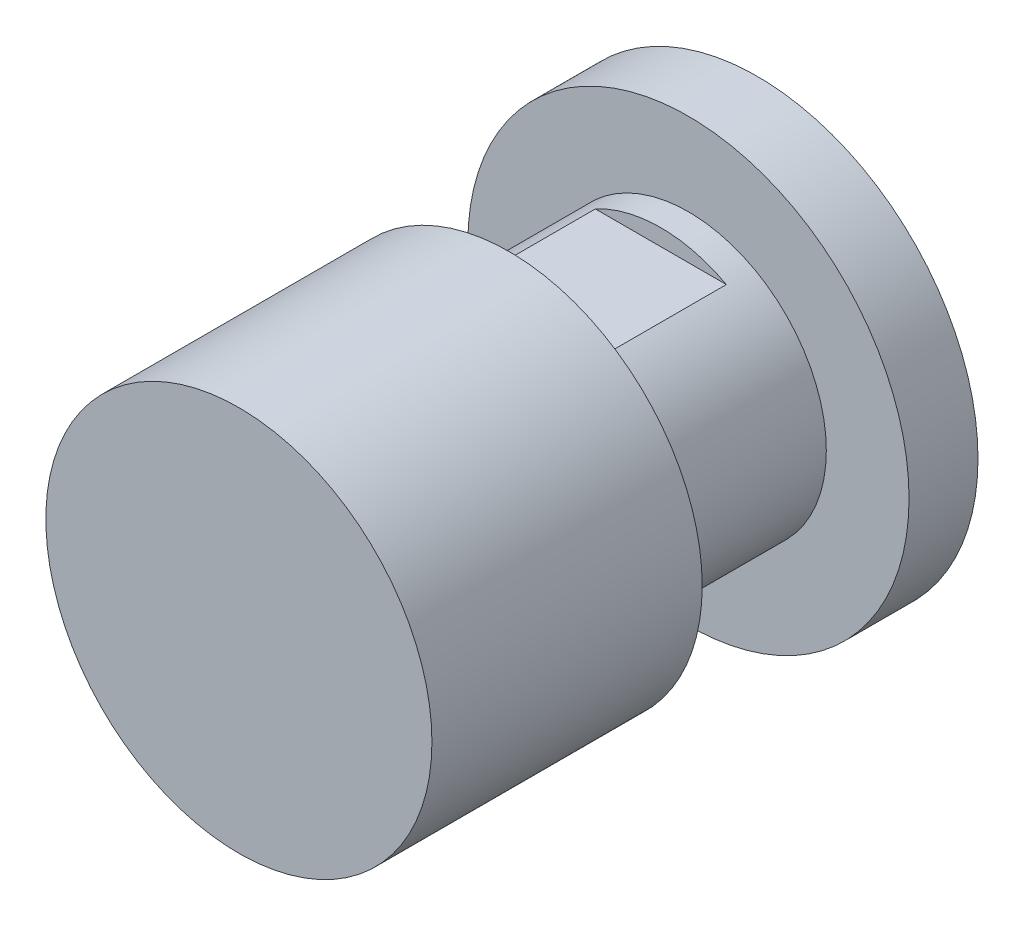
ISO-10303-21;
HEADER;
FILE_DESCRIPTION(('STEP AP214'),'2;1');
FILE_NAME('part.step','',(''),(''),'','','');
FILE_SCHEMA(('AUTOMOTIVE_DESIGN { 1 0 10303 214 1 1 1 1 }'));
ENDSEC;
DATA;
#1=APPLICATION_CONTEXT('core data for automotive mechanical design processes');
#2=APPLICATION_PROTOCOL_DEFINITION('international standard','automotive_design',2000,#1);
#3=PRODUCT_CONTEXT('',#1,'mechanical');
#4=PRODUCT('Part','Part','',(#3));
#5=PRODUCT_RELATED_PRODUCT_CATEGORY('part','',(#4));
#6=PRODUCT_DEFINITION_FORMATION('','',#4);
#7=PRODUCT_DEFINITION_CONTEXT('part definition',#1,'design');
#8=PRODUCT_DEFINITION('design','',#6,#7);
#9=PRODUCT_DEFINITION_SHAPE('','',#8);
#10=(LENGTH_UNIT() NAMED_UNIT(*) SI_UNIT(.MILLI.,.METRE.));
#11=(NAMED_UNIT(*) PLANE_ANGLE_UNIT() SI_UNIT($,.RADIAN.));
#12=(NAMED_UNIT(*) SI_UNIT($,.STERADIAN.) SOLID_ANGLE_UNIT());
#13=UNCERTAINTY_MEASURE_WITH_UNIT(LENGTH_MEASURE(1.E-05),#10,'distance_accuracy_value','');
#14=(GEOMETRIC_REPRESENTATION_CONTEXT(3) GLOBAL_UNCERTAINTY_ASSIGNED_CONTEXT((#13)) GLOBAL_UNIT_ASSIGNED_CONTEXT((#10,
#11,#12)) REPRESENTATION_CONTEXT('',''));
#15=CARTESIAN_POINT('',(0.,0.,0.));
#16=DIRECTION('',(0.,0.,1.));
#17=DIRECTION('',(1.,0.,0.));
#18=AXIS2_PLACEMENT_3D('',#15,#16,#17);
#19=CARTESIAN_POINT('',(0.,0.,29.));
#20=DIRECTION('',(0.,0.,-1.));
#21=DIRECTION('',(-1.,0.,0.));
#22=AXIS2_PLACEMENT_3D('',#19,#20,#21);
#23=CYLINDRICAL_SURFACE('',#22,10.);
#24=CARTESIAN_POINT('',(0.,0.,5.));
#25=DIRECTION('',(0.,0.,1.));
#26=DIRECTION('',(1.,0.,0.));
#27=AXIS2_PLACEMENT_3D('',#24,#25,#26);
#28=CIRCLE('',#27,10.);
#29=CARTESIAN_POINT('',(10.,0.,5.));
#30=VERTEX_POINT('',#29);
#31=EDGE_CURVE('E83',#30,#30,#28,.T.);
#32=ORIENTED_EDGE('',*,*,#31,.T.);
#33=EDGE_LOOP('',(#32));
#34=FACE_BOUND('',#33,.T.);
#35=CARTESIAN_POINT('',(0.,0.,16.));
#36=DIRECTION('',(0.,0.,1.));
#37=DIRECTION('',(1.,0.,0.));
#38=AXIS2_PLACEMENT_3D('',#35,#36,#37);
#39=CIRCLE('',#38,10.);
#40=CARTESIAN_POINT('',(-4.74973683481517,-8.8,16.));
#41=VERTEX_POINT('',#40);
#42=CARTESIAN_POINT('',(4.74973683481517,-8.8,16.));
#43=VERTEX_POINT('',#42);
#44=EDGE_CURVE('E91',#41,#43,#39,.T.);
#45=ORIENTED_EDGE('',*,*,#44,.T.);
#46=DIRECTION('',(0.,0.,-1.));
#47=VECTOR('',#46,1.);
#48=CARTESIAN_POINT('',(4.74973683481517,-8.8,29.));
#49=LINE('',#48,#47);
#50=CARTESIAN_POINT('',(4.74973683481517,-8.8,7.));
#51=VERTEX_POINT('',#50);
#52=EDGE_CURVE('E90',#43,#51,#49,.T.);
#53=ORIENTED_EDGE('',*,*,#52,.T.);
#54=CARTESIAN_POINT('',(0.,0.,7.));
#55=DIRECTION('',(0.,0.,1.));
#56=DIRECTION('',(1.,0.,0.));
#57=AXIS2_PLACEMENT_3D('',#54,#55,#56);
#58=CIRCLE('',#57,10.);
#59=CARTESIAN_POINT('',(-4.74973683481517,-8.8,7.));
#60=VERTEX_POINT('',#59);
#61=EDGE_CURVE('E82',#60,#51,#58,.T.);
#62=ORIENTED_EDGE('',*,*,#61,.F.);
#63=DIRECTION('',(0.,0.,-1.));
#64=VECTOR('',#63,1.);
#65=CARTESIAN_POINT('',(-4.74973683481517,-8.8,29.));
#66=LINE('',#65,#64);
#67=EDGE_CURVE('E74',#60,#41,#66,.F.);
#68=ORIENTED_EDGE('',*,*,#67,.T.);
#69=EDGE_LOOP('',(#45,#53,#62,#68));
#70=FACE_BOUND('',#69,.T.);
#71=CARTESIAN_POINT('',(4.74973683481517,8.8,16.));
#72=VERTEX_POINT('',#71);
#73=CARTESIAN_POINT('',(-4.74973683481517,8.8,16.));
#74=VERTEX_POINT('',#73);
#75=EDGE_CURVE('E95',#72,#74,#39,.T.);
#76=ORIENTED_EDGE('',*,*,#75,.T.);
#77=DIRECTION('',(0.,0.,-1.));
#78=VECTOR('',#77,1.);
#79=CARTESIAN_POINT('',(-4.74973683481517,8.8,29.));
#80=LINE('',#79,#78);
#81=CARTESIAN_POINT('',(-4.74973683481517,8.8,7.));
#82=VERTEX_POINT('',#81);
#83=EDGE_CURVE('E42',#74,#82,#80,.T.);
#84=ORIENTED_EDGE('',*,*,#83,.T.);
#85=CARTESIAN_POINT('',(4.74973683481517,8.8,7.));
#86=VERTEX_POINT('',#85);
#87=EDGE_CURVE('E93',#86,#82,#58,.T.);
#88=ORIENTED_EDGE('',*,*,#87,.F.);
#89=DIRECTION('',(0.,0.,-1.));
#90=VECTOR('',#89,1.);
#91=CARTESIAN_POINT('',(4.74973683481517,8.8,29.));
#92=LINE('',#91,#90);
#93=EDGE_CURVE('E96',#86,#72,#92,.F.);
#94=ORIENTED_EDGE('',*,*,#93,.T.);
#95=EDGE_LOOP('',(#76,#84,#88,#94));
#96=FACE_BOUND('',#95,.T.);
#97=CARTESIAN_POINT('',(0.,0.,18.));
#98=DIRECTION('',(0.,0.,1.));
#99=DIRECTION('',(1.,0.,0.));
#100=AXIS2_PLACEMENT_3D('',#97,#98,#99);
#101=CIRCLE('',#100,10.);
#102=CARTESIAN_POINT('',(10.,0.,18.));
#103=VERTEX_POINT('',#102);
#104=EDGE_CURVE('E12',#103,#103,#101,.T.);
#105=ORIENTED_EDGE('',*,*,#104,.F.);
#106=EDGE_LOOP('',(#105));
#107=FACE_BOUND('',#106,.T.);
#108=ADVANCED_FACE('F34',(#34,#70,#96,#107),#23,.T.);
#109=CARTESIAN_POINT('',(0.,0.,5.));
#110=DIRECTION('',(0.,0.,-1.));
#111=DIRECTION('',(-1.,0.,0.));
#112=AXIS2_PLACEMENT_3D('',#109,#110,#111);
#113=CYLINDRICAL_SURFACE('',#112,16.);
#114=CARTESIAN_POINT('',(0.,0.,5.));
#115=DIRECTION('',(0.,0.,1.));
#116=DIRECTION('',(1.,0.,0.));
#117=AXIS2_PLACEMENT_3D('',#114,#115,#116);
#118=CIRCLE('',#117,16.);
#119=CARTESIAN_POINT('',(16.,0.,5.));
#120=VERTEX_POINT('',#119);
#121=EDGE_CURVE('E121',#120,#120,#118,.T.);
#122=ORIENTED_EDGE('',*,*,#121,.F.);
#123=EDGE_LOOP('',(#122));
#124=FACE_BOUND('',#123,.T.);
#125=CARTESIAN_POINT('',(0.,0.,0.));
#126=DIRECTION('',(0.,0.,1.));
#127=DIRECTION('',(1.,0.,0.));
#128=AXIS2_PLACEMENT_3D('',#125,#126,#127);
#129=CIRCLE('',#128,16.);
#130=CARTESIAN_POINT('',(16.,0.,0.));
#131=VERTEX_POINT('',#130);
#132=EDGE_CURVE('E111',#131,#131,#129,.T.);
#133=ORIENTED_EDGE('',*,*,#132,.T.);
#134=EDGE_LOOP('',(#133));
#135=FACE_BOUND('',#134,.T.);
#136=ADVANCED_FACE('F36',(#124,#135),#113,.T.);
#137=CARTESIAN_POINT('',(0.,0.,5.));
#138=DIRECTION('',(0.,0.,1.));
#139=DIRECTION('',(1.,0.,0.));
#140=AXIS2_PLACEMENT_3D('',#137,#138,#139);
#141=PLANE('',#140);
#142=ORIENTED_EDGE('',*,*,#31,.F.);
#143=EDGE_LOOP('',(#142));
#144=FACE_BOUND('',#143,.T.);
#145=ORIENTED_EDGE('',*,*,#121,.T.);
#146=EDGE_LOOP('',(#145));
#147=FACE_BOUND('',#146,.T.);
#148=ADVANCED_FACE('F130',(#144,#147),#141,.T.);
#149=CARTESIAN_POINT('',(0.,0.,0.));
#150=DIRECTION('',(0.,0.,1.));
#151=DIRECTION('',(1.,0.,0.));
#152=AXIS2_PLACEMENT_3D('',#149,#150,#151);
#153=PLANE('',#152);
#154=ORIENTED_EDGE('',*,*,#132,.F.);
#155=EDGE_LOOP('',(#154));
#156=FACE_BOUND('',#155,.T.);
#157=ADVANCED_FACE('F128',(#156),#153,.F.);
#158=CARTESIAN_POINT('',(-12.,-8.8,16.));
#159=DIRECTION('',(0.,1.,0.));
#160=DIRECTION('',(0.,0.,1.));
#161=AXIS2_PLACEMENT_3D('',#158,#159,#160);
#162=PLANE('',#161);
#163=DIRECTION('',(1.,0.,0.));
#164=VECTOR('',#163,1.);
#165=CARTESIAN_POINT('',(-12.,-8.8,16.));
#166=LINE('',#165,#164);
#167=EDGE_CURVE('E57',#41,#43,#166,.T.);
#168=ORIENTED_EDGE('',*,*,#167,.F.);
#169=ORIENTED_EDGE('',*,*,#67,.F.);
#170=DIRECTION('',(1.,0.,0.));
#171=VECTOR('',#170,1.);
#172=CARTESIAN_POINT('',(-12.,-8.8,7.));
#173=LINE('',#172,#171);
#174=EDGE_CURVE('E77',#60,#51,#173,.T.);
#175=ORIENTED_EDGE('',*,*,#174,.T.);
#176=ORIENTED_EDGE('',*,*,#52,.F.);
#177=EDGE_LOOP('',(#168,#169,#175,#176));
#178=FACE_BOUND('',#177,.T.);
#179=ADVANCED_FACE('F76',(#178),#162,.F.);
#180=CARTESIAN_POINT('',(0.,0.,7.));
#181=DIRECTION('',(0.,0.,1.));
#182=DIRECTION('',(1.,0.,0.));
#183=AXIS2_PLACEMENT_3D('',#180,#181,#182);
#184=PLANE('',#183);
#185=ORIENTED_EDGE('',*,*,#61,.T.);
#186=ORIENTED_EDGE('',*,*,#174,.F.);
#187=EDGE_LOOP('',(#185,#186));
#188=FACE_BOUND('',#187,.T.);
#189=ADVANCED_FACE('F86',(#188),#184,.T.);
#190=CARTESIAN_POINT('',(0.,0.,16.));
#191=DIRECTION('',(0.,0.,1.));
#192=DIRECTION('',(1.,0.,0.));
#193=AXIS2_PLACEMENT_3D('',#190,#191,#192);
#194=PLANE('',#193);
#195=ORIENTED_EDGE('',*,*,#167,.T.);
#196=ORIENTED_EDGE('',*,*,#44,.F.);
#197=EDGE_LOOP('',(#195,#196));
#198=FACE_BOUND('',#197,.T.);
#199=ADVANCED_FACE('F153',(#198),#194,.F.);
#200=DIRECTION('',(-1.,0.,0.));
#201=VECTOR('',#200,1.);
#202=CARTESIAN_POINT('',(-12.,8.8,16.));
#203=LINE('',#202,#201);
#204=EDGE_CURVE('E49',#72,#74,#203,.T.);
#205=ORIENTED_EDGE('',*,*,#204,.T.);
#206=ORIENTED_EDGE('',*,*,#75,.F.);
#207=EDGE_LOOP('',(#205,#206));
#208=FACE_BOUND('',#207,.T.);
#209=ADVANCED_FACE('F109',(#208),#194,.F.);
#210=ORIENTED_EDGE('',*,*,#87,.T.);
#211=DIRECTION('',(-1.,0.,0.));
#212=VECTOR('',#211,1.);
#213=CARTESIAN_POINT('',(-12.,8.8,7.));
#214=LINE('',#213,#212);
#215=EDGE_CURVE('E87',#86,#82,#214,.T.);
#216=ORIENTED_EDGE('',*,*,#215,.F.);
#217=EDGE_LOOP('',(#210,#216));
#218=FACE_BOUND('',#217,.T.);
#219=ADVANCED_FACE('F148',(#218),#184,.T.);
#220=CARTESIAN_POINT('',(-12.,8.8,16.));
#221=DIRECTION('',(0.,-1.,0.));
#222=DIRECTION('',(0.,0.,-1.));
#223=AXIS2_PLACEMENT_3D('',#220,#221,#222);
#224=PLANE('',#223);
#225=ORIENTED_EDGE('',*,*,#204,.F.);
#226=ORIENTED_EDGE('',*,*,#93,.F.);
#227=ORIENTED_EDGE('',*,*,#215,.T.);
#228=ORIENTED_EDGE('',*,*,#83,.F.);
#229=EDGE_LOOP('',(#225,#226,#227,#228));
#230=FACE_BOUND('',#229,.T.);
#231=ADVANCED_FACE('F107',(#230),#224,.F.);
#232=CARTESIAN_POINT('',(0.,0.,37.6));
#233=DIRECTION('',(0.,0.,-1.));
#234=DIRECTION('',(-1.,0.,0.));
#235=AXIS2_PLACEMENT_3D('',#232,#233,#234);
#236=CYLINDRICAL_SURFACE('',#235,14.);
#237=CARTESIAN_POINT('',(0.,0.,37.6));
#238=DIRECTION('',(0.,0.,1.));
#239=DIRECTION('',(1.,0.,0.));
#240=AXIS2_PLACEMENT_3D('',#237,#238,#239);
#241=CIRCLE('',#240,14.);
#242=CARTESIAN_POINT('',(14.,0.,37.6));
#243=VERTEX_POINT('',#242);
#244=EDGE_CURVE('E117',#243,#243,#241,.T.);
#245=ORIENTED_EDGE('',*,*,#244,.F.);
#246=EDGE_LOOP('',(#245));
#247=FACE_BOUND('',#246,.T.);
#248=CARTESIAN_POINT('',(0.,0.,18.));
#249=DIRECTION('',(0.,0.,1.));
#250=DIRECTION('',(1.,0.,0.));
#251=AXIS2_PLACEMENT_3D('',#248,#249,#250);
#252=CIRCLE('',#251,14.);
#253=CARTESIAN_POINT('',(14.,0.,18.));
#254=VERTEX_POINT('',#253);
#255=EDGE_CURVE('E114',#254,#254,#252,.T.);
#256=ORIENTED_EDGE('',*,*,#255,.T.);
#257=EDGE_LOOP('',(#256));
#258=FACE_BOUND('',#257,.T.);
#259=ADVANCED_FACE('F155',(#247,#258),#236,.T.);
#260=CARTESIAN_POINT('',(0.,0.,37.6));
#261=DIRECTION('',(0.,0.,1.));
#262=DIRECTION('',(1.,0.,0.));
#263=AXIS2_PLACEMENT_3D('',#260,#261,#262);
#264=PLANE('',#263);
#265=ORIENTED_EDGE('',*,*,#244,.T.);
#266=EDGE_LOOP('',(#265));
#267=FACE_BOUND('',#266,.T.);
#268=ADVANCED_FACE('F159',(#267),#264,.T.);
#269=CARTESIAN_POINT('',(0.,0.,18.));
#270=DIRECTION('',(0.,0.,1.));
#271=DIRECTION('',(1.,0.,0.));
#272=AXIS2_PLACEMENT_3D('',#269,#270,#271);
#273=PLANE('',#272);
#274=ORIENTED_EDGE('',*,*,#104,.T.);
#275=EDGE_LOOP('',(#274));
#276=FACE_BOUND('',#275,.T.);
#277=ORIENTED_EDGE('',*,*,#255,.F.);
#278=EDGE_LOOP('',(#277));
#279=FACE_BOUND('',#278,.T.);
#280=ADVANCED_FACE('F161',(#276,#279),#273,.F.);
#281=CLOSED_SHELL('',(#108,#136,#148,#157,#179,#189,#199,#209,#219,#231,#259,#268,#280));
#282=MANIFOLD_SOLID_BREP('B2',#281);
#283=ADVANCED_BREP_SHAPE_REPRESENTATION('',(#18,#282),#14);
#284=SHAPE_DEFINITION_REPRESENTATION(#9,#283);
ENDSEC;
END-ISO-10303-21;
